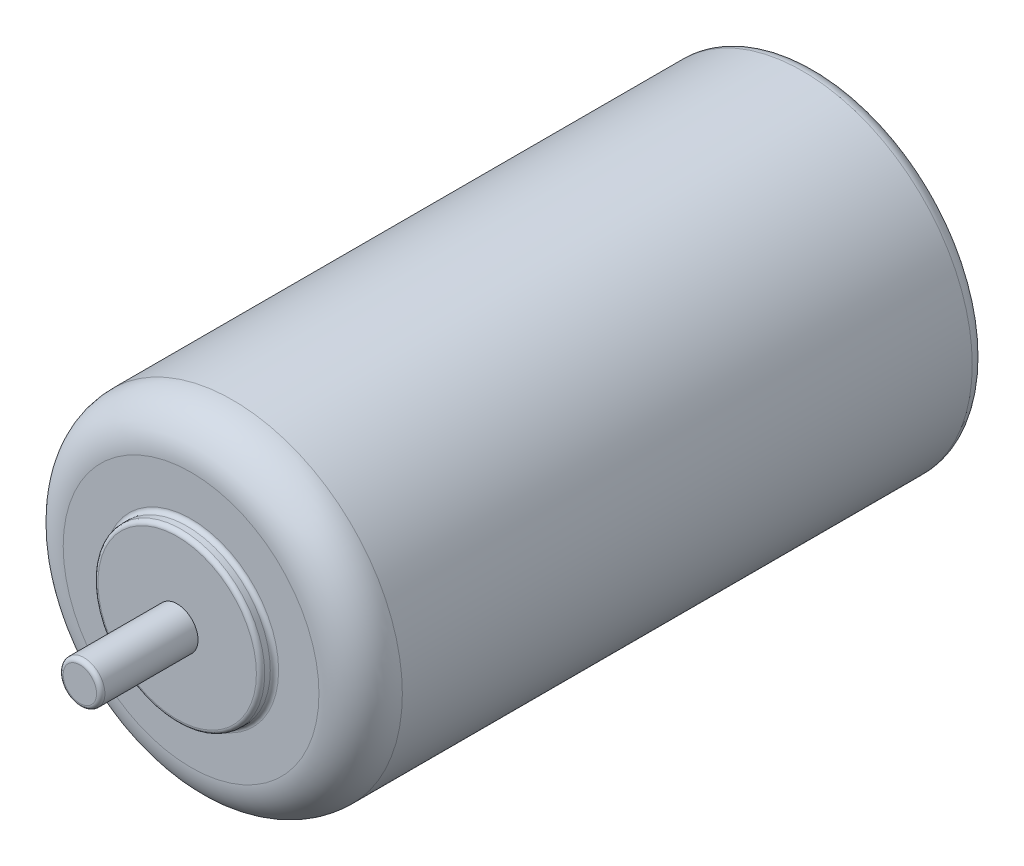
ISO-10303-21;
HEADER;
FILE_DESCRIPTION(('STEP AP214'),'2;1');
FILE_NAME('part.step','',(''),(''),'','','');
FILE_SCHEMA(('AUTOMOTIVE_DESIGN { 1 0 10303 214 1 1 1 1 }'));
ENDSEC;
DATA;
#1=APPLICATION_CONTEXT('core data for automotive mechanical design processes');
#2=APPLICATION_PROTOCOL_DEFINITION('international standard','automotive_design',2000,#1);
#3=PRODUCT_CONTEXT('',#1,'mechanical');
#4=PRODUCT('Part','Part','',(#3));
#5=PRODUCT_RELATED_PRODUCT_CATEGORY('part','',(#4));
#6=PRODUCT_DEFINITION_FORMATION('','',#4);
#7=PRODUCT_DEFINITION_CONTEXT('part definition',#1,'design');
#8=PRODUCT_DEFINITION('design','',#6,#7);
#9=PRODUCT_DEFINITION_SHAPE('','',#8);
#10=(LENGTH_UNIT() NAMED_UNIT(*) SI_UNIT(.MILLI.,.METRE.));
#11=(NAMED_UNIT(*) PLANE_ANGLE_UNIT() SI_UNIT($,.RADIAN.));
#12=(NAMED_UNIT(*) SI_UNIT($,.STERADIAN.) SOLID_ANGLE_UNIT());
#13=UNCERTAINTY_MEASURE_WITH_UNIT(LENGTH_MEASURE(1.E-05),#10,'distance_accuracy_value','');
#14=(GEOMETRIC_REPRESENTATION_CONTEXT(3) GLOBAL_UNCERTAINTY_ASSIGNED_CONTEXT((#13)) GLOBAL_UNIT_ASSIGNED_CONTEXT((#10,
#11,#12)) REPRESENTATION_CONTEXT('',''));
#15=CARTESIAN_POINT('',(0.,0.,0.));
#16=DIRECTION('',(0.,0.,1.));
#17=DIRECTION('',(1.,0.,0.));
#18=AXIS2_PLACEMENT_3D('',#15,#16,#17);
#19=CARTESIAN_POINT('',(0.,0.,45.));
#20=DIRECTION('',(0.,0.,-1.));
#21=DIRECTION('',(-1.,0.,0.));
#22=AXIS2_PLACEMENT_3D('',#19,#20,#21);
#23=CYLINDRICAL_SURFACE('',#22,12.2);
#24=CARTESIAN_POINT('',(0.,0.,1.));
#25=DIRECTION('',(0.,0.,1.));
#26=DIRECTION('',(1.,0.,0.));
#27=AXIS2_PLACEMENT_3D('',#24,#25,#26);
#28=CIRCLE('',#27,12.2);
#29=CARTESIAN_POINT('',(-12.2,0.,0.999999999999994));
#30=VERTEX_POINT('',#29);
#31=EDGE_CURVE('E60',#30,#30,#28,.T.);
#32=CARTESIAN_POINT('',(0.,0.,42.));
#33=DIRECTION('',(0.,0.,1.));
#34=DIRECTION('',(1.,0.,0.));
#35=AXIS2_PLACEMENT_3D('',#32,#33,#34);
#36=CIRCLE('',#35,12.2);
#37=CARTESIAN_POINT('',(-12.2,0.,42.));
#38=VERTEX_POINT('',#37);
#39=EDGE_CURVE('E63',#38,#38,#36,.F.);
#40=CARTESIAN_POINT('',(-12.2,0.,0.999999999999994));
#41=CARTESIAN_POINT('',(-12.2,0.,1.42708333333333));
#42=CARTESIAN_POINT('',(-12.2,0.,1.85416666666666));
#43=CARTESIAN_POINT('',(-12.2,0.,2.70833333333333));
#44=CARTESIAN_POINT('',(-12.2,0.,3.13541666666666));
#45=CARTESIAN_POINT('',(-12.2,0.,3.98958333333333));
#46=CARTESIAN_POINT('',(-12.2,0.,4.41666666666666));
#47=CARTESIAN_POINT('',(-12.2,0.,5.27083333333333));
#48=CARTESIAN_POINT('',(-12.2,0.,5.69791666666666));
#49=CARTESIAN_POINT('',(-12.2,0.,6.55208333333333));
#50=CARTESIAN_POINT('',(-12.2,0.,6.97916666666666));
#51=CARTESIAN_POINT('',(-12.2,0.,7.83333333333333));
#52=CARTESIAN_POINT('',(-12.2,0.,8.26041666666666));
#53=CARTESIAN_POINT('',(-12.2,0.,9.11458333333333));
#54=CARTESIAN_POINT('',(-12.2,0.,9.54166666666666));
#55=CARTESIAN_POINT('',(-12.2,0.,10.3958333333333));
#56=CARTESIAN_POINT('',(-12.2,0.,10.8229166666667));
#57=CARTESIAN_POINT('',(-12.2,0.,11.6770833333333));
#58=CARTESIAN_POINT('',(-12.2,0.,12.1041666666667));
#59=CARTESIAN_POINT('',(-12.2,0.,12.9583333333333));
#60=CARTESIAN_POINT('',(-12.2,0.,13.3854166666667));
#61=CARTESIAN_POINT('',(-12.2,0.,14.2395833333333));
#62=CARTESIAN_POINT('',(-12.2,0.,14.6666666666667));
#63=CARTESIAN_POINT('',(-12.2,0.,15.5208333333333));
#64=CARTESIAN_POINT('',(-12.2,0.,15.9479166666667));
#65=CARTESIAN_POINT('',(-12.2,0.,16.8020833333333));
#66=CARTESIAN_POINT('',(-12.2,0.,17.2291666666667));
#67=CARTESIAN_POINT('',(-12.2,0.,18.0833333333333));
#68=CARTESIAN_POINT('',(-12.2,0.,18.5104166666667));
#69=CARTESIAN_POINT('',(-12.2,0.,19.3645833333333));
#70=CARTESIAN_POINT('',(-12.2,0.,19.7916666666667));
#71=CARTESIAN_POINT('',(-12.2,0.,20.6458333333333));
#72=CARTESIAN_POINT('',(-12.2,0.,21.0729166666667));
#73=CARTESIAN_POINT('',(-12.2,0.,21.9270833333333));
#74=CARTESIAN_POINT('',(-12.2,0.,22.3541666666667));
#75=CARTESIAN_POINT('',(-12.2,0.,23.2083333333333));
#76=CARTESIAN_POINT('',(-12.2,0.,23.6354166666667));
#77=CARTESIAN_POINT('',(-12.2,0.,24.4895833333333));
#78=CARTESIAN_POINT('',(-12.2,0.,24.9166666666667));
#79=CARTESIAN_POINT('',(-12.2,0.,25.7708333333333));
#80=CARTESIAN_POINT('',(-12.2,0.,26.1979166666667));
#81=CARTESIAN_POINT('',(-12.2,0.,27.0520833333333));
#82=CARTESIAN_POINT('',(-12.2,0.,27.4791666666667));
#83=CARTESIAN_POINT('',(-12.2,0.,28.3333333333333));
#84=CARTESIAN_POINT('',(-12.2,0.,28.7604166666667));
#85=CARTESIAN_POINT('',(-12.2,0.,29.6145833333333));
#86=CARTESIAN_POINT('',(-12.2,0.,30.0416666666667));
#87=CARTESIAN_POINT('',(-12.2,0.,30.8958333333333));
#88=CARTESIAN_POINT('',(-12.2,0.,31.3229166666667));
#89=CARTESIAN_POINT('',(-12.2,0.,32.1770833333333));
#90=CARTESIAN_POINT('',(-12.2,0.,32.6041666666667));
#91=CARTESIAN_POINT('',(-12.2,0.,33.4583333333333));
#92=CARTESIAN_POINT('',(-12.2,0.,33.8854166666667));
#93=CARTESIAN_POINT('',(-12.2,0.,34.7395833333333));
#94=CARTESIAN_POINT('',(-12.2,0.,35.1666666666667));
#95=CARTESIAN_POINT('',(-12.2,0.,36.0208333333333));
#96=CARTESIAN_POINT('',(-12.2,0.,36.4479166666667));
#97=CARTESIAN_POINT('',(-12.2,0.,37.3020833333333));
#98=CARTESIAN_POINT('',(-12.2,0.,37.7291666666667));
#99=CARTESIAN_POINT('',(-12.2,0.,38.5833333333333));
#100=CARTESIAN_POINT('',(-12.2,0.,39.0104166666667));
#101=CARTESIAN_POINT('',(-12.2,0.,39.8645833333333));
#102=CARTESIAN_POINT('',(-12.2,0.,40.2916666666667));
#103=CARTESIAN_POINT('',(-12.2,0.,41.1458333333333));
#104=CARTESIAN_POINT('',(-12.2,0.,41.5729166666667));
#105=CARTESIAN_POINT('',(-12.2,0.,42.));
#106=B_SPLINE_CURVE_WITH_KNOTS('',3,(#40,#41,#42,#43,#44,#45,#46,#47,#48,#49,#50,#51,#52,#53,
#54,#55,#56,#57,#58,#59,#60,#61,#62,#63,#64,#65,#66,#67,#68,#69,#70,#71,#72,#73,#74,#75,#76,#77,
#78,#79,#80,#81,#82,#83,#84,#85,#86,#87,#88,#89,#90,#91,#92,#93,#94,#95,#96,#97,#98,#99,#100,
#101,#102,#103,#104,#105),.UNSPECIFIED.,.F.,.F.,(4,2,2,2,2,2,2,2,2,2,2,2,2,2,2,2,2,2,2,2,2,2,2,
2,2,2,2,2,2,2,2,2,4),(0.,1.28125,2.5625,3.84375,5.125,6.40625,7.6875,8.96875,10.25,11.53125,
12.8125,14.09375,15.375,16.65625,17.9375,19.21875,20.5,21.78125,23.0625,24.34375,25.625,
26.90625,28.1875,29.46875,30.75,32.03125,33.3125,34.59375,35.875,37.15625,38.4375,39.71875,41.),.UNSPECIFIED.);
#107=EDGE_CURVE('BSEAM31',#30,#38,#106,.T.);
#108=ORIENTED_EDGE('',*,*,#31,.T.);
#109=ORIENTED_EDGE('',*,*,#39,.T.);
#110=ORIENTED_EDGE('',*,*,#107,.T.);
#111=ORIENTED_EDGE('',*,*,#107,.F.);
#112=EDGE_LOOP('',(#108,#110,#109,#111));
#113=FACE_BOUND('',#112,.T.);
#114=ADVANCED_FACE('F31',(#113),#23,.T.);
#115=CARTESIAN_POINT('',(0.,0.,45.));
#116=DIRECTION('',(0.,0.,1.));
#117=DIRECTION('',(1.,0.,0.));
#118=AXIS2_PLACEMENT_3D('',#115,#116,#117);
#119=PLANE('',#118);
#120=CARTESIAN_POINT('',(0.,0.,45.));
#121=DIRECTION('',(0.,0.,1.));
#122=DIRECTION('',(1.,0.,0.));
#123=AXIS2_PLACEMENT_3D('',#120,#121,#122);
#124=CIRCLE('',#123,6.3);
#125=CARTESIAN_POINT('',(6.3,0.,45.));
#126=VERTEX_POINT('',#125);
#127=EDGE_CURVE('E42',#126,#126,#124,.F.);
#128=ORIENTED_EDGE('',*,*,#127,.T.);
#129=EDGE_LOOP('',(#128));
#130=FACE_BOUND('',#129,.T.);
#131=CARTESIAN_POINT('',(0.,0.,45.));
#132=DIRECTION('',(0.,0.,1.));
#133=DIRECTION('',(1.,0.,0.));
#134=AXIS2_PLACEMENT_3D('',#131,#132,#133);
#135=CIRCLE('',#134,9.2);
#136=CARTESIAN_POINT('',(9.2,0.,45.));
#137=VERTEX_POINT('',#136);
#138=EDGE_CURVE('E66',#137,#137,#135,.T.);
#139=ORIENTED_EDGE('',*,*,#138,.T.);
#140=EDGE_LOOP('',(#139));
#141=FACE_BOUND('',#140,.T.);
#142=ADVANCED_FACE('F89',(#130,#141),#119,.T.);
#143=CARTESIAN_POINT('',(0.,0.,0.));
#144=DIRECTION('',(0.,0.,1.));
#145=DIRECTION('',(1.,0.,0.));
#146=AXIS2_PLACEMENT_3D('',#143,#144,#145);
#147=PLANE('',#146);
#148=CARTESIAN_POINT('',(0.,0.,0.));
#149=DIRECTION('',(0.,0.,1.));
#150=DIRECTION('',(1.,0.,0.));
#151=AXIS2_PLACEMENT_3D('',#148,#149,#150);
#152=CIRCLE('',#151,11.2);
#153=CARTESIAN_POINT('',(11.2,0.,0.));
#154=VERTEX_POINT('',#153);
#155=EDGE_CURVE('E57',#154,#154,#152,.F.);
#156=ORIENTED_EDGE('',*,*,#155,.T.);
#157=EDGE_LOOP('',(#156));
#158=FACE_BOUND('',#157,.T.);
#159=ADVANCED_FACE('F95',(#158),#147,.F.);
#160=CARTESIAN_POINT('',(0.,0.,46.));
#161=DIRECTION('',(0.,0.,-1.));
#162=DIRECTION('',(-1.,0.,0.));
#163=AXIS2_PLACEMENT_3D('',#160,#161,#162);
#164=CYLINDRICAL_SURFACE('',#163,6.);
#165=CARTESIAN_POINT('',(0.,0.,45.7));
#166=DIRECTION('',(0.,0.,1.));
#167=DIRECTION('',(1.,0.,0.));
#168=AXIS2_PLACEMENT_3D('',#165,#166,#167);
#169=CIRCLE('',#168,6.);
#170=CARTESIAN_POINT('',(6.,0.,45.7));
#171=VERTEX_POINT('',#170);
#172=EDGE_CURVE('E46',#171,#171,#169,.F.);
#173=ORIENTED_EDGE('',*,*,#172,.T.);
#174=EDGE_LOOP('',(#173));
#175=FACE_BOUND('',#174,.T.);
#176=CARTESIAN_POINT('',(0.,0.,45.3));
#177=DIRECTION('',(0.,0.,1.));
#178=DIRECTION('',(1.,0.,0.));
#179=AXIS2_PLACEMENT_3D('',#176,#177,#178);
#180=CIRCLE('',#179,6.);
#181=CARTESIAN_POINT('',(6.,0.,45.3));
#182=VERTEX_POINT('',#181);
#183=EDGE_CURVE('E51',#182,#182,#180,.T.);
#184=ORIENTED_EDGE('',*,*,#183,.T.);
#185=EDGE_LOOP('',(#184));
#186=FACE_BOUND('',#185,.T.);
#187=ADVANCED_FACE('F85',(#175,#186),#164,.T.);
#188=CARTESIAN_POINT('',(0.,0.,46.));
#189=DIRECTION('',(0.,0.,1.));
#190=DIRECTION('',(1.,0.,0.));
#191=AXIS2_PLACEMENT_3D('',#188,#189,#190);
#192=PLANE('',#191);
#193=CARTESIAN_POINT('',(0.,0.,46.));
#194=DIRECTION('',(0.,0.,1.));
#195=DIRECTION('',(1.,0.,0.));
#196=AXIS2_PLACEMENT_3D('',#193,#194,#195);
#197=CIRCLE('',#196,5.7);
#198=CARTESIAN_POINT('',(5.7,0.,46.));
#199=VERTEX_POINT('',#198);
#200=EDGE_CURVE('E54',#199,#199,#197,.T.);
#201=ORIENTED_EDGE('',*,*,#200,.T.);
#202=EDGE_LOOP('',(#201));
#203=FACE_BOUND('',#202,.T.);
#204=CARTESIAN_POINT('',(0.,0.,46.));
#205=DIRECTION('',(0.,0.,1.));
#206=DIRECTION('',(1.,0.,0.));
#207=AXIS2_PLACEMENT_3D('',#204,#205,#206);
#208=CIRCLE('',#207,1.5);
#209=CARTESIAN_POINT('',(1.5,0.,46.));
#210=VERTEX_POINT('',#209);
#211=EDGE_CURVE('E69',#210,#210,#208,.F.);
#212=ORIENTED_EDGE('',*,*,#211,.T.);
#213=EDGE_LOOP('',(#212));
#214=FACE_BOUND('',#213,.T.);
#215=ADVANCED_FACE('F73',(#203,#214),#192,.T.);
#216=CARTESIAN_POINT('',(0.,0.,53.));
#217=DIRECTION('',(0.,0.,-1.));
#218=DIRECTION('',(-1.,0.,0.));
#219=AXIS2_PLACEMENT_3D('',#216,#217,#218);
#220=CYLINDRICAL_SURFACE('',#219,1.5);
#221=CARTESIAN_POINT('',(0.,0.,52.7));
#222=DIRECTION('',(0.,0.,1.));
#223=DIRECTION('',(1.,0.,0.));
#224=AXIS2_PLACEMENT_3D('',#221,#222,#223);
#225=CIRCLE('',#224,1.5);
#226=CARTESIAN_POINT('',(1.5,0.,52.7));
#227=VERTEX_POINT('',#226);
#228=EDGE_CURVE('E10',#227,#227,#225,.F.);
#229=ORIENTED_EDGE('',*,*,#228,.T.);
#230=EDGE_LOOP('',(#229));
#231=FACE_BOUND('',#230,.T.);
#232=ORIENTED_EDGE('',*,*,#211,.F.);
#233=EDGE_LOOP('',(#232));
#234=FACE_BOUND('',#233,.T.);
#235=ADVANCED_FACE('F75',(#231,#234),#220,.T.);
#236=CARTESIAN_POINT('',(0.,0.,53.));
#237=DIRECTION('',(0.,0.,1.));
#238=DIRECTION('',(1.,0.,0.));
#239=AXIS2_PLACEMENT_3D('',#236,#237,#238);
#240=PLANE('',#239);
#241=CARTESIAN_POINT('',(0.,0.,53.));
#242=DIRECTION('',(0.,0.,1.));
#243=DIRECTION('',(1.,0.,0.));
#244=AXIS2_PLACEMENT_3D('',#241,#242,#243);
#245=CIRCLE('',#244,1.2);
#246=CARTESIAN_POINT('',(1.2,0.,53.));
#247=VERTEX_POINT('',#246);
#248=EDGE_CURVE('E38',#247,#247,#245,.T.);
#249=ORIENTED_EDGE('',*,*,#248,.T.);
#250=EDGE_LOOP('',(#249));
#251=FACE_BOUND('',#250,.T.);
#252=ADVANCED_FACE('F77',(#251),#240,.T.);
#253=CARTESIAN_POINT('',(0.,0.,42.));
#254=DIRECTION('',(0.,0.,1.));
#255=DIRECTION('',(1.,0.,0.));
#256=AXIS2_PLACEMENT_3D('',#253,#254,#255);
#257=TOROIDAL_SURFACE('',#256,9.2,3.);
#258=ORIENTED_EDGE('',*,*,#39,.F.);
#259=EDGE_LOOP('',(#258));
#260=FACE_BOUND('',#259,.T.);
#261=ORIENTED_EDGE('',*,*,#138,.F.);
#262=EDGE_LOOP('',(#261));
#263=FACE_BOUND('',#262,.T.);
#264=ADVANCED_FACE('F83',(#260,#263),#257,.T.);
#265=CARTESIAN_POINT('',(0.,0.,1.));
#266=DIRECTION('',(0.,0.,1.));
#267=DIRECTION('',(1.,0.,0.));
#268=AXIS2_PLACEMENT_3D('',#265,#266,#267);
#269=TOROIDAL_SURFACE('',#268,11.2,1.);
#270=ORIENTED_EDGE('',*,*,#155,.F.);
#271=EDGE_LOOP('',(#270));
#272=FACE_BOUND('',#271,.T.);
#273=ORIENTED_EDGE('',*,*,#31,.F.);
#274=EDGE_LOOP('',(#273));
#275=FACE_BOUND('',#274,.T.);
#276=ADVANCED_FACE('F103',(#272,#275),#269,.T.);
#277=CARTESIAN_POINT('',(0.,0.,45.7));
#278=DIRECTION('',(0.,0.,1.));
#279=DIRECTION('',(1.,0.,0.));
#280=AXIS2_PLACEMENT_3D('',#277,#278,#279);
#281=TOROIDAL_SURFACE('',#280,5.7,0.3);
#282=ORIENTED_EDGE('',*,*,#172,.F.);
#283=EDGE_LOOP('',(#282));
#284=FACE_BOUND('',#283,.T.);
#285=ORIENTED_EDGE('',*,*,#200,.F.);
#286=EDGE_LOOP('',(#285));
#287=FACE_BOUND('',#286,.T.);
#288=ADVANCED_FACE('F107',(#284,#287),#281,.T.);
#289=CARTESIAN_POINT('',(0.,0.,45.3));
#290=DIRECTION('',(0.,0.,1.));
#291=DIRECTION('',(1.,0.,0.));
#292=AXIS2_PLACEMENT_3D('',#289,#290,#291);
#293=TOROIDAL_SURFACE('',#292,6.3,0.3);
#294=ORIENTED_EDGE('',*,*,#127,.F.);
#295=EDGE_LOOP('',(#294));
#296=FACE_BOUND('',#295,.T.);
#297=ORIENTED_EDGE('',*,*,#183,.F.);
#298=EDGE_LOOP('',(#297));
#299=FACE_BOUND('',#298,.T.);
#300=ADVANCED_FACE('F110',(#296,#299),#293,.F.);
#301=CARTESIAN_POINT('',(0.,0.,52.7));
#302=DIRECTION('',(0.,0.,1.));
#303=DIRECTION('',(1.,0.,0.));
#304=AXIS2_PLACEMENT_3D('',#301,#302,#303);
#305=TOROIDAL_SURFACE('',#304,1.2,0.3);
#306=ORIENTED_EDGE('',*,*,#228,.F.);
#307=EDGE_LOOP('',(#306));
#308=FACE_BOUND('',#307,.T.);
#309=ORIENTED_EDGE('',*,*,#248,.F.);
#310=EDGE_LOOP('',(#309));
#311=FACE_BOUND('',#310,.T.);
#312=ADVANCED_FACE('F33',(#308,#311),#305,.T.);
#313=CLOSED_SHELL('',(#114,#142,#159,#187,#215,#235,#252,#264,#276,#288,#300,#312));
#314=MANIFOLD_SOLID_BREP('B2',#313);
#315=ADVANCED_BREP_SHAPE_REPRESENTATION('',(#18,#314),#14);
#316=SHAPE_DEFINITION_REPRESENTATION(#9,#315);
ENDSEC;
END-ISO-10303-21;
